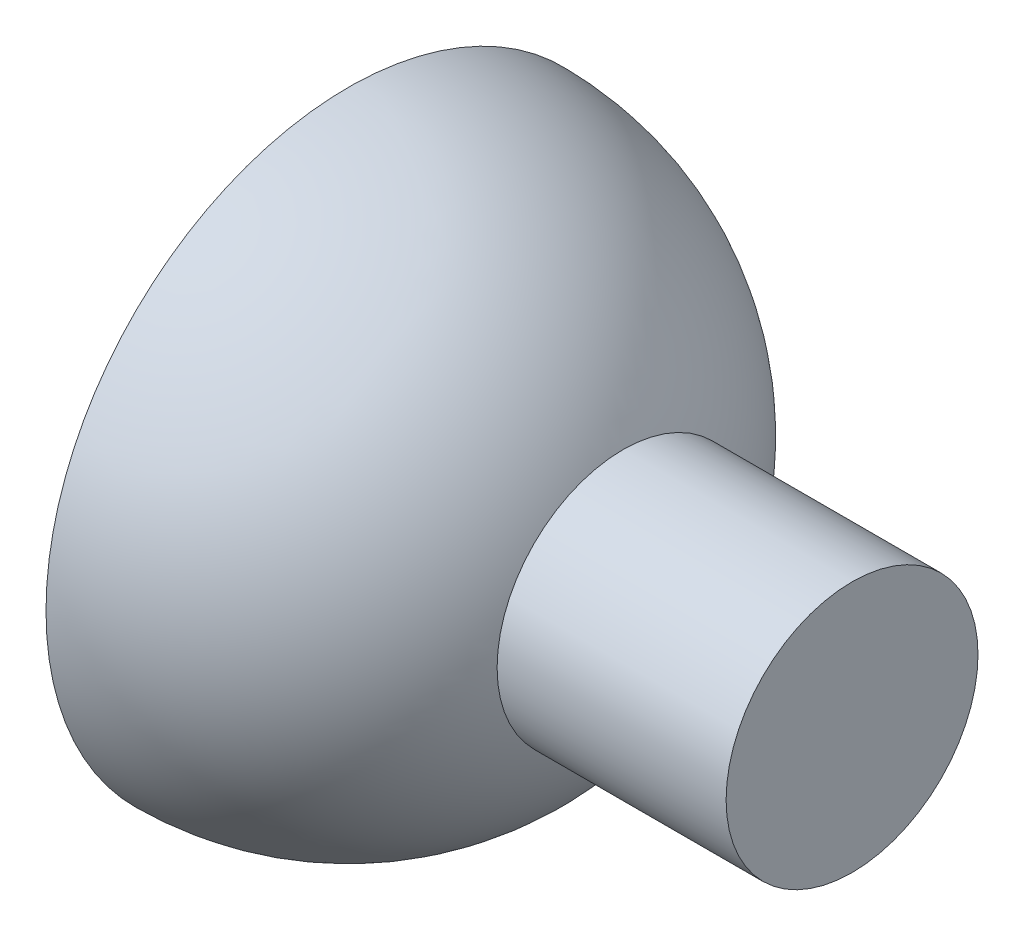
ISO-10303-21;
HEADER;
FILE_DESCRIPTION(('STEP AP214'),'2;1');
FILE_NAME('part.step','',(''),(''),'','','');
FILE_SCHEMA(('AUTOMOTIVE_DESIGN { 1 0 10303 214 1 1 1 1 }'));
ENDSEC;
DATA;
#1=APPLICATION_CONTEXT('core data for automotive mechanical design processes');
#2=APPLICATION_PROTOCOL_DEFINITION('international standard','automotive_design',2000,#1);
#3=PRODUCT_CONTEXT('',#1,'mechanical');
#4=PRODUCT('Part','Part','',(#3));
#5=PRODUCT_RELATED_PRODUCT_CATEGORY('part','',(#4));
#6=PRODUCT_DEFINITION_FORMATION('','',#4);
#7=PRODUCT_DEFINITION_CONTEXT('part definition',#1,'design');
#8=PRODUCT_DEFINITION('design','',#6,#7);
#9=PRODUCT_DEFINITION_SHAPE('','',#8);
#10=(LENGTH_UNIT() NAMED_UNIT(*) SI_UNIT(.MILLI.,.METRE.));
#11=(NAMED_UNIT(*) PLANE_ANGLE_UNIT() SI_UNIT($,.RADIAN.));
#12=(NAMED_UNIT(*) SI_UNIT($,.STERADIAN.) SOLID_ANGLE_UNIT());
#13=UNCERTAINTY_MEASURE_WITH_UNIT(LENGTH_MEASURE(1.E-05),#10,'distance_accuracy_value','');
#14=(GEOMETRIC_REPRESENTATION_CONTEXT(3) GLOBAL_UNCERTAINTY_ASSIGNED_CONTEXT((#13)) GLOBAL_UNIT_ASSIGNED_CONTEXT((#10,
#11,#12)) REPRESENTATION_CONTEXT('',''));
#15=CARTESIAN_POINT('',(0.,0.,0.));
#16=DIRECTION('',(0.,0.,1.));
#17=DIRECTION('',(1.,0.,0.));
#18=AXIS2_PLACEMENT_3D('',#15,#16,#17);
#19=CARTESIAN_POINT('',(0.,0.,0.));
#20=DIRECTION('',(-1.,0.,0.));
#21=DIRECTION('',(0.,1.,0.));
#22=AXIS2_PLACEMENT_3D('',#19,#20,#21);
#23=SPHERICAL_SURFACE('',#22,12.);
#24=CARTESIAN_POINT('',(0.,0.,0.));
#25=DIRECTION('',(-1.,0.,0.));
#26=DIRECTION('',(0.,0.,1.));
#27=AXIS2_PLACEMENT_3D('',#24,#25,#26);
#28=CIRCLE('',#27,12.);
#29=CARTESIAN_POINT('',(0.,0.,12.));
#30=VERTEX_POINT('',#29);
#31=EDGE_CURVE('E55',#30,#30,#28,.T.);
#32=ORIENTED_EDGE('',*,*,#31,.F.);
#33=EDGE_LOOP('',(#32));
#34=FACE_BOUND('',#33,.T.);
#35=CARTESIAN_POINT('',(10.9087121146357,0.,0.));
#36=DIRECTION('',(-1.,0.,0.));
#37=DIRECTION('',(0.,0.,1.));
#38=AXIS2_PLACEMENT_3D('',#35,#36,#37);
#39=CIRCLE('',#38,5.);
#40=CARTESIAN_POINT('',(10.9087121146357,0.,5.));
#41=VERTEX_POINT('',#40);
#42=EDGE_CURVE('E10',#41,#41,#39,.F.);
#43=ORIENTED_EDGE('',*,*,#42,.F.);
#44=EDGE_LOOP('',(#43));
#45=FACE_BOUND('',#44,.T.);
#46=ADVANCED_FACE('F44',(#34,#45),#23,.T.);
#47=CARTESIAN_POINT('',(0.,10.,0.));
#48=DIRECTION('',(-1.,0.,0.));
#49=DIRECTION('',(0.,0.,1.));
#50=AXIS2_PLACEMENT_3D('',#47,#48,#49);
#51=PLANE('',#50);
#52=ORIENTED_EDGE('',*,*,#31,.T.);
#53=EDGE_LOOP('',(#52));
#54=FACE_BOUND('',#53,.T.);
#55=CARTESIAN_POINT('',(0.,0.,0.));
#56=DIRECTION('',(-1.,0.,0.));
#57=DIRECTION('',(0.,0.,1.));
#58=AXIS2_PLACEMENT_3D('',#55,#56,#57);
#59=CIRCLE('',#58,10.);
#60=CARTESIAN_POINT('',(0.,0.,10.));
#61=VERTEX_POINT('',#60);
#62=EDGE_CURVE('E60',#61,#61,#59,.T.);
#63=ORIENTED_EDGE('',*,*,#62,.F.);
#64=EDGE_LOOP('',(#63));
#65=FACE_BOUND('',#64,.T.);
#66=ADVANCED_FACE('F79',(#54,#65),#51,.T.);
#67=CARTESIAN_POINT('',(0.,0.,0.));
#68=DIRECTION('',(-1.,0.,0.));
#69=DIRECTION('',(0.,1.,0.));
#70=AXIS2_PLACEMENT_3D('',#67,#68,#69);
#71=SPHERICAL_SURFACE('',#70,10.);
#72=ORIENTED_EDGE('',*,*,#62,.T.);
#73=EDGE_LOOP('',(#72));
#74=FACE_BOUND('',#73,.T.);
#75=ADVANCED_FACE('F80',(#74),#71,.F.);
#76=CARTESIAN_POINT('',(-12.001,0.,0.));
#77=DIRECTION('',(1.,0.,0.));
#78=DIRECTION('',(0.,0.,-1.));
#79=AXIS2_PLACEMENT_3D('',#76,#77,#78);
#80=CYLINDRICAL_SURFACE('',#79,5.);
#81=ORIENTED_EDGE('',*,*,#42,.T.);
#82=EDGE_LOOP('',(#81));
#83=FACE_BOUND('',#82,.T.);
#84=CARTESIAN_POINT('',(20.,0.,0.));
#85=DIRECTION('',(-1.,0.,0.));
#86=DIRECTION('',(0.,0.,1.));
#87=AXIS2_PLACEMENT_3D('',#84,#85,#86);
#88=CIRCLE('',#87,5.);
#89=CARTESIAN_POINT('',(20.,0.,5.));
#90=VERTEX_POINT('',#89);
#91=EDGE_CURVE('E65',#90,#90,#88,.T.);
#92=ORIENTED_EDGE('',*,*,#91,.T.);
#93=EDGE_LOOP('',(#92));
#94=FACE_BOUND('',#93,.T.);
#95=ADVANCED_FACE('F68',(#83,#94),#80,.T.);
#96=CARTESIAN_POINT('',(20.,0.,0.));
#97=DIRECTION('',(-1.,0.,0.));
#98=DIRECTION('',(0.,0.,1.));
#99=AXIS2_PLACEMENT_3D('',#96,#97,#98);
#100=PLANE('',#99);
#101=ORIENTED_EDGE('',*,*,#91,.F.);
#102=EDGE_LOOP('',(#101));
#103=FACE_BOUND('',#102,.T.);
#104=ADVANCED_FACE('F72',(#103),#100,.F.);
#105=CLOSED_SHELL('',(#46,#66,#75,#95,#104));
#106=MANIFOLD_SOLID_BREP('B2',#105);
#107=ADVANCED_BREP_SHAPE_REPRESENTATION('',(#18,#106),#14);
#108=SHAPE_DEFINITION_REPRESENTATION(#9,#107);
ENDSEC;
END-ISO-10303-21;
